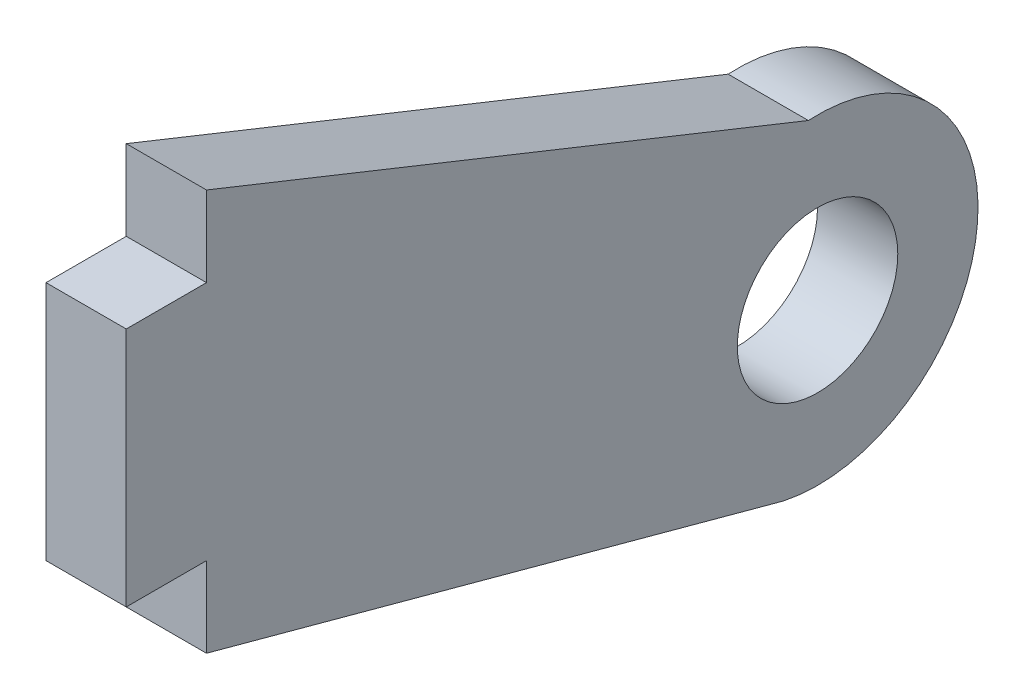
ISO-10303-21;
HEADER;
FILE_DESCRIPTION(('STEP AP214'),'2;1');
FILE_NAME('part.step','',(''),(''),'','','');
FILE_SCHEMA(('AUTOMOTIVE_DESIGN { 1 0 10303 214 1 1 1 1 }'));
ENDSEC;
DATA;
#1=APPLICATION_CONTEXT('core data for automotive mechanical design processes');
#2=APPLICATION_PROTOCOL_DEFINITION('international standard','automotive_design',2000,#1);
#3=PRODUCT_CONTEXT('',#1,'mechanical');
#4=PRODUCT('Part','Part','',(#3));
#5=PRODUCT_RELATED_PRODUCT_CATEGORY('part','',(#4));
#6=PRODUCT_DEFINITION_FORMATION('','',#4);
#7=PRODUCT_DEFINITION_CONTEXT('part definition',#1,'design');
#8=PRODUCT_DEFINITION('design','',#6,#7);
#9=PRODUCT_DEFINITION_SHAPE('','',#8);
#10=(LENGTH_UNIT() NAMED_UNIT(*) SI_UNIT(.MILLI.,.METRE.));
#11=(NAMED_UNIT(*) PLANE_ANGLE_UNIT() SI_UNIT($,.RADIAN.));
#12=(NAMED_UNIT(*) SI_UNIT($,.STERADIAN.) SOLID_ANGLE_UNIT());
#13=UNCERTAINTY_MEASURE_WITH_UNIT(LENGTH_MEASURE(1.E-05),#10,'distance_accuracy_value','');
#14=(GEOMETRIC_REPRESENTATION_CONTEXT(3) GLOBAL_UNCERTAINTY_ASSIGNED_CONTEXT((#13)) GLOBAL_UNIT_ASSIGNED_CONTEXT((#10,
#11,#12)) REPRESENTATION_CONTEXT('',''));
#15=CARTESIAN_POINT('',(0.,0.,0.));
#16=DIRECTION('',(0.,0.,1.));
#17=DIRECTION('',(1.,0.,0.));
#18=AXIS2_PLACEMENT_3D('',#15,#16,#17);
#19=CARTESIAN_POINT('',(2.,-4.99344630629626,-16.2288811891108));
#20=DIRECTION('',(1.,0.,0.));
#21=DIRECTION('',(0.,0.,-1.));
#22=AXIS2_PLACEMENT_3D('',#19,#20,#21);
#23=PLANE('',#22);
#24=DIRECTION('',(0.,0.,-1.));
#25=VECTOR('',#24,1.);
#26=CARTESIAN_POINT('',(2.,-3.,1.));
#27=LINE('',#26,#25);
#28=CARTESIAN_POINT('',(2.,-3.,1.));
#29=VERTEX_POINT('',#28);
#30=CARTESIAN_POINT('',(2.,-3.,-1.));
#31=VERTEX_POINT('',#30);
#32=EDGE_CURVE('E145',#29,#31,#27,.T.);
#33=ORIENTED_EDGE('',*,*,#32,.T.);
#34=DIRECTION('',(0.,-1.,0.));
#35=VECTOR('',#34,1.);
#36=CARTESIAN_POINT('',(2.,-5.,-1.));
#37=LINE('',#36,#35);
#38=CARTESIAN_POINT('',(2.,-5.,-1.));
#39=VERTEX_POINT('',#38);
#40=EDGE_CURVE('E93',#31,#39,#37,.T.);
#41=ORIENTED_EDGE('',*,*,#40,.T.);
#42=DIRECTION('',(0.,-0.261950631674574,-0.965081274590535));
#43=VECTOR('',#42,1.);
#44=CARTESIAN_POINT('',(2.,-5.,-1.));
#45=LINE('',#44,#43);
#46=CARTESIAN_POINT('',(2.,-8.8,-15.));
#47=VERTEX_POINT('',#46);
#48=EDGE_CURVE('E160',#39,#47,#45,.T.);
#49=ORIENTED_EDGE('',*,*,#48,.T.);
#50=CARTESIAN_POINT('',(2.,-4.99344630629626,-16.2288811891108));
#51=DIRECTION('',(1.,0.,0.));
#52=DIRECTION('',(0.,0.,-1.));
#53=AXIS2_PLACEMENT_3D('',#50,#51,#52);
#54=CIRCLE('',#53,4.);
#55=CARTESIAN_POINT('',(2.,-1.,-16.));
#56=VERTEX_POINT('',#55);
#57=EDGE_CURVE('E173',#47,#56,#54,.T.);
#58=ORIENTED_EDGE('',*,*,#57,.T.);
#59=DIRECTION('',(0.,0.371390676354104,0.928476690885259));
#60=VECTOR('',#59,1.);
#61=CARTESIAN_POINT('',(2.,5.,-1.));
#62=LINE('',#61,#60);
#63=CARTESIAN_POINT('',(2.,5.,-1.));
#64=VERTEX_POINT('',#63);
#65=EDGE_CURVE('E112',#56,#64,#62,.T.);
#66=ORIENTED_EDGE('',*,*,#65,.T.);
#67=DIRECTION('',(0.,-1.,0.));
#68=VECTOR('',#67,1.);
#69=CARTESIAN_POINT('',(2.,3.,-1.));
#70=LINE('',#69,#68);
#71=CARTESIAN_POINT('',(2.,3.,-1.));
#72=VERTEX_POINT('',#71);
#73=EDGE_CURVE('E106',#64,#72,#70,.T.);
#74=ORIENTED_EDGE('',*,*,#73,.T.);
#75=DIRECTION('',(0.,0.,1.));
#76=VECTOR('',#75,1.);
#77=CARTESIAN_POINT('',(2.,3.,1.));
#78=LINE('',#77,#76);
#79=CARTESIAN_POINT('',(2.,3.,1.));
#80=VERTEX_POINT('',#79);
#81=EDGE_CURVE('E110',#72,#80,#78,.T.);
#82=ORIENTED_EDGE('',*,*,#81,.T.);
#83=DIRECTION('',(0.,-1.,0.));
#84=VECTOR('',#83,1.);
#85=CARTESIAN_POINT('',(2.,3.,1.));
#86=LINE('',#85,#84);
#87=EDGE_CURVE('E50',#80,#29,#86,.T.);
#88=ORIENTED_EDGE('',*,*,#87,.T.);
#89=EDGE_LOOP('',(#33,#41,#49,#58,#66,#74,#82,#88));
#90=FACE_BOUND('',#89,.T.);
#91=CARTESIAN_POINT('',(2.,-4.99344630629626,-16.2288811891108));
#92=DIRECTION('',(1.,0.,0.));
#93=DIRECTION('',(0.,0.,-1.));
#94=AXIS2_PLACEMENT_3D('',#91,#92,#93);
#95=CIRCLE('',#94,2.00000000000001);
#96=CARTESIAN_POINT('',(2.,-4.99344630629626,-18.2288811891108));
#97=VERTEX_POINT('',#96);
#98=EDGE_CURVE('E134',#97,#97,#95,.T.);
#99=ORIENTED_EDGE('',*,*,#98,.F.);
#100=EDGE_LOOP('',(#99));
#101=FACE_BOUND('',#100,.T.);
#102=ADVANCED_FACE('F33',(#90,#101),#23,.T.);
#103=CARTESIAN_POINT('',(0.,-4.99344630629626,-16.2288811891108));
#104=DIRECTION('',(1.,0.,0.));
#105=DIRECTION('',(0.,0.,-1.));
#106=AXIS2_PLACEMENT_3D('',#103,#104,#105);
#107=PLANE('',#106);
#108=DIRECTION('',(0.,0.,-1.));
#109=VECTOR('',#108,1.);
#110=CARTESIAN_POINT('',(0.,-3.,1.));
#111=LINE('',#110,#109);
#112=CARTESIAN_POINT('',(0.,-3.,1.));
#113=VERTEX_POINT('',#112);
#114=CARTESIAN_POINT('',(0.,-3.,-1.));
#115=VERTEX_POINT('',#114);
#116=EDGE_CURVE('E130',#113,#115,#111,.T.);
#117=ORIENTED_EDGE('',*,*,#116,.F.);
#118=DIRECTION('',(0.,-1.,0.));
#119=VECTOR('',#118,1.);
#120=CARTESIAN_POINT('',(0.,3.,1.));
#121=LINE('',#120,#119);
#122=CARTESIAN_POINT('',(0.,3.,1.));
#123=VERTEX_POINT('',#122);
#124=EDGE_CURVE('E85',#123,#113,#121,.T.);
#125=ORIENTED_EDGE('',*,*,#124,.F.);
#126=DIRECTION('',(0.,0.,1.));
#127=VECTOR('',#126,1.);
#128=CARTESIAN_POINT('',(0.,3.,1.));
#129=LINE('',#128,#127);
#130=CARTESIAN_POINT('',(0.,3.,-1.));
#131=VERTEX_POINT('',#130);
#132=EDGE_CURVE('E79',#131,#123,#129,.T.);
#133=ORIENTED_EDGE('',*,*,#132,.F.);
#134=DIRECTION('',(0.,-1.,0.));
#135=VECTOR('',#134,1.);
#136=CARTESIAN_POINT('',(0.,3.,-1.));
#137=LINE('',#136,#135);
#138=CARTESIAN_POINT('',(0.,5.,-1.));
#139=VERTEX_POINT('',#138);
#140=EDGE_CURVE('E120',#139,#131,#137,.T.);
#141=ORIENTED_EDGE('',*,*,#140,.F.);
#142=DIRECTION('',(0.,0.371390676354104,0.928476690885259));
#143=VECTOR('',#142,1.);
#144=CARTESIAN_POINT('',(0.,5.,-1.));
#145=LINE('',#144,#143);
#146=CARTESIAN_POINT('',(0.,-1.,-16.));
#147=VERTEX_POINT('',#146);
#148=EDGE_CURVE('E140',#147,#139,#145,.T.);
#149=ORIENTED_EDGE('',*,*,#148,.F.);
#150=CARTESIAN_POINT('',(0.,-4.99344630629626,-16.2288811891108));
#151=DIRECTION('',(1.,0.,0.));
#152=DIRECTION('',(0.,0.,-1.));
#153=AXIS2_PLACEMENT_3D('',#150,#151,#152);
#154=CIRCLE('',#153,4.);
#155=CARTESIAN_POINT('',(0.,-8.8,-15.));
#156=VERTEX_POINT('',#155);
#157=EDGE_CURVE('E138',#156,#147,#154,.T.);
#158=ORIENTED_EDGE('',*,*,#157,.F.);
#159=DIRECTION('',(0.,-0.261950631674574,-0.965081274590535));
#160=VECTOR('',#159,1.);
#161=CARTESIAN_POINT('',(0.,-5.,-1.));
#162=LINE('',#161,#160);
#163=CARTESIAN_POINT('',(0.,-5.,-1.));
#164=VERTEX_POINT('',#163);
#165=EDGE_CURVE('E136',#164,#156,#162,.T.);
#166=ORIENTED_EDGE('',*,*,#165,.F.);
#167=DIRECTION('',(0.,-1.,0.));
#168=VECTOR('',#167,1.);
#169=CARTESIAN_POINT('',(0.,-5.,-1.));
#170=LINE('',#169,#168);
#171=EDGE_CURVE('E133',#115,#164,#170,.T.);
#172=ORIENTED_EDGE('',*,*,#171,.F.);
#173=EDGE_LOOP('',(#117,#125,#133,#141,#149,#158,#166,#172));
#174=FACE_BOUND('',#173,.T.);
#175=CARTESIAN_POINT('',(0.,-4.99344630629626,-16.2288811891108));
#176=DIRECTION('',(1.,0.,0.));
#177=DIRECTION('',(0.,0.,-1.));
#178=AXIS2_PLACEMENT_3D('',#175,#176,#177);
#179=CIRCLE('',#178,2.00000000000001);
#180=CARTESIAN_POINT('',(0.,-4.99344630629626,-18.2288811891108));
#181=VERTEX_POINT('',#180);
#182=EDGE_CURVE('E179',#181,#181,#179,.T.);
#183=ORIENTED_EDGE('',*,*,#182,.T.);
#184=EDGE_LOOP('',(#183));
#185=FACE_BOUND('',#184,.T.);
#186=ADVANCED_FACE('F164',(#174,#185),#107,.F.);
#187=CARTESIAN_POINT('',(2.,-3.,1.));
#188=DIRECTION('',(0.,1.,0.));
#189=DIRECTION('',(0.,0.,1.));
#190=AXIS2_PLACEMENT_3D('',#187,#188,#189);
#191=PLANE('',#190);
#192=ORIENTED_EDGE('',*,*,#116,.T.);
#193=DIRECTION('',(-1.,0.,0.));
#194=VECTOR('',#193,1.);
#195=CARTESIAN_POINT('',(2.,-3.,-1.));
#196=LINE('',#195,#194);
#197=EDGE_CURVE('E11',#31,#115,#196,.T.);
#198=ORIENTED_EDGE('',*,*,#197,.F.);
#199=ORIENTED_EDGE('',*,*,#32,.F.);
#200=DIRECTION('',(-1.,0.,0.));
#201=VECTOR('',#200,1.);
#202=CARTESIAN_POINT('',(2.,-3.,1.));
#203=LINE('',#202,#201);
#204=EDGE_CURVE('E126',#29,#113,#203,.T.);
#205=ORIENTED_EDGE('',*,*,#204,.T.);
#206=EDGE_LOOP('',(#192,#198,#199,#205));
#207=FACE_BOUND('',#206,.T.);
#208=ADVANCED_FACE('F35',(#207),#191,.F.);
#209=CARTESIAN_POINT('',(2.,-5.,-1.));
#210=DIRECTION('',(0.,0.,-1.));
#211=DIRECTION('',(0.,1.,0.));
#212=AXIS2_PLACEMENT_3D('',#209,#210,#211);
#213=PLANE('',#212);
#214=ORIENTED_EDGE('',*,*,#171,.T.);
#215=DIRECTION('',(-1.,0.,0.));
#216=VECTOR('',#215,1.);
#217=CARTESIAN_POINT('',(2.,-5.,-1.));
#218=LINE('',#217,#216);
#219=EDGE_CURVE('E42',#39,#164,#218,.T.);
#220=ORIENTED_EDGE('',*,*,#219,.F.);
#221=ORIENTED_EDGE('',*,*,#40,.F.);
#222=ORIENTED_EDGE('',*,*,#197,.T.);
#223=EDGE_LOOP('',(#214,#220,#221,#222));
#224=FACE_BOUND('',#223,.T.);
#225=ADVANCED_FACE('F207',(#224),#213,.F.);
#226=CARTESIAN_POINT('',(2.,-5.,-1.));
#227=DIRECTION('',(0.,0.965081274590535,-0.261950631674574));
#228=DIRECTION('',(0.,0.261950631674574,0.965081274590535));
#229=AXIS2_PLACEMENT_3D('',#226,#227,#228);
#230=PLANE('',#229);
#231=ORIENTED_EDGE('',*,*,#165,.T.);
#232=DIRECTION('',(-1.,0.,0.));
#233=VECTOR('',#232,1.);
#234=CARTESIAN_POINT('',(2.,-8.8,-15.));
#235=LINE('',#234,#233);
#236=EDGE_CURVE('E152',#47,#156,#235,.T.);
#237=ORIENTED_EDGE('',*,*,#236,.F.);
#238=ORIENTED_EDGE('',*,*,#48,.F.);
#239=ORIENTED_EDGE('',*,*,#219,.T.);
#240=EDGE_LOOP('',(#231,#237,#238,#239));
#241=FACE_BOUND('',#240,.T.);
#242=ADVANCED_FACE('F158',(#241),#230,.F.);
#243=CARTESIAN_POINT('',(2.,-4.99344630629626,-16.2288811891108));
#244=DIRECTION('',(-1.,0.,0.));
#245=DIRECTION('',(0.,0.,1.));
#246=AXIS2_PLACEMENT_3D('',#243,#244,#245);
#247=CYLINDRICAL_SURFACE('',#246,4.);
#248=ORIENTED_EDGE('',*,*,#157,.T.);
#249=DIRECTION('',(-1.,0.,0.));
#250=VECTOR('',#249,1.);
#251=CARTESIAN_POINT('',(2.,-1.,-16.));
#252=LINE('',#251,#250);
#253=EDGE_CURVE('E149',#56,#147,#252,.T.);
#254=ORIENTED_EDGE('',*,*,#253,.F.);
#255=ORIENTED_EDGE('',*,*,#57,.F.);
#256=ORIENTED_EDGE('',*,*,#236,.T.);
#257=EDGE_LOOP('',(#248,#254,#255,#256));
#258=FACE_BOUND('',#257,.T.);
#259=ADVANCED_FACE('F169',(#258),#247,.T.);
#260=CARTESIAN_POINT('',(2.,5.,-1.));
#261=DIRECTION('',(0.,-0.928476690885259,0.371390676354104));
#262=DIRECTION('',(0.,-0.371390676354104,-0.928476690885259));
#263=AXIS2_PLACEMENT_3D('',#260,#261,#262);
#264=PLANE('',#263);
#265=ORIENTED_EDGE('',*,*,#148,.T.);
#266=DIRECTION('',(-1.,0.,0.));
#267=VECTOR('',#266,1.);
#268=CARTESIAN_POINT('',(2.,5.,-1.));
#269=LINE('',#268,#267);
#270=EDGE_CURVE('E121',#64,#139,#269,.T.);
#271=ORIENTED_EDGE('',*,*,#270,.F.);
#272=ORIENTED_EDGE('',*,*,#65,.F.);
#273=ORIENTED_EDGE('',*,*,#253,.T.);
#274=EDGE_LOOP('',(#265,#271,#272,#273));
#275=FACE_BOUND('',#274,.T.);
#276=ADVANCED_FACE('F172',(#275),#264,.F.);
#277=CARTESIAN_POINT('',(2.,3.,-1.));
#278=DIRECTION('',(0.,0.,-1.));
#279=DIRECTION('',(-1.,0.,0.));
#280=AXIS2_PLACEMENT_3D('',#277,#278,#279);
#281=PLANE('',#280);
#282=ORIENTED_EDGE('',*,*,#140,.T.);
#283=DIRECTION('',(-1.,0.,0.));
#284=VECTOR('',#283,1.);
#285=CARTESIAN_POINT('',(2.,3.,-1.));
#286=LINE('',#285,#284);
#287=EDGE_CURVE('E117',#72,#131,#286,.T.);
#288=ORIENTED_EDGE('',*,*,#287,.F.);
#289=ORIENTED_EDGE('',*,*,#73,.F.);
#290=ORIENTED_EDGE('',*,*,#270,.T.);
#291=EDGE_LOOP('',(#282,#288,#289,#290));
#292=FACE_BOUND('',#291,.T.);
#293=ADVANCED_FACE('F118',(#292),#281,.F.);
#294=CARTESIAN_POINT('',(2.,3.,1.));
#295=DIRECTION('',(0.,-1.,0.));
#296=DIRECTION('',(0.,0.,-1.));
#297=AXIS2_PLACEMENT_3D('',#294,#295,#296);
#298=PLANE('',#297);
#299=ORIENTED_EDGE('',*,*,#132,.T.);
#300=DIRECTION('',(-1.,0.,0.));
#301=VECTOR('',#300,1.);
#302=CARTESIAN_POINT('',(2.,3.,1.));
#303=LINE('',#302,#301);
#304=EDGE_CURVE('E122',#80,#123,#303,.T.);
#305=ORIENTED_EDGE('',*,*,#304,.F.);
#306=ORIENTED_EDGE('',*,*,#81,.F.);
#307=ORIENTED_EDGE('',*,*,#287,.T.);
#308=EDGE_LOOP('',(#299,#305,#306,#307));
#309=FACE_BOUND('',#308,.T.);
#310=ADVANCED_FACE('F124',(#309),#298,.F.);
#311=CARTESIAN_POINT('',(2.,3.,1.));
#312=DIRECTION('',(0.,0.,-1.));
#313=DIRECTION('',(0.,1.,0.));
#314=AXIS2_PLACEMENT_3D('',#311,#312,#313);
#315=PLANE('',#314);
#316=ORIENTED_EDGE('',*,*,#124,.T.);
#317=ORIENTED_EDGE('',*,*,#204,.F.);
#318=ORIENTED_EDGE('',*,*,#87,.F.);
#319=ORIENTED_EDGE('',*,*,#304,.T.);
#320=EDGE_LOOP('',(#316,#317,#318,#319));
#321=FACE_BOUND('',#320,.T.);
#322=ADVANCED_FACE('F195',(#321),#315,.F.);
#323=CARTESIAN_POINT('',(2.,-4.99344630629626,-16.2288811891108));
#324=DIRECTION('',(-1.,0.,0.));
#325=DIRECTION('',(0.,0.,1.));
#326=AXIS2_PLACEMENT_3D('',#323,#324,#325);
#327=CYLINDRICAL_SURFACE('',#326,2.00000000000001);
#328=ORIENTED_EDGE('',*,*,#98,.T.);
#329=EDGE_LOOP('',(#328));
#330=FACE_BOUND('',#329,.T.);
#331=ORIENTED_EDGE('',*,*,#182,.F.);
#332=EDGE_LOOP('',(#331));
#333=FACE_BOUND('',#332,.T.);
#334=ADVANCED_FACE('F185',(#330,#333),#327,.F.);
#335=CLOSED_SHELL('',(#102,#186,#208,#225,#242,#259,#276,#293,#310,#322,#334));
#336=MANIFOLD_SOLID_BREP('B2',#335);
#337=ADVANCED_BREP_SHAPE_REPRESENTATION('',(#18,#336),#14);
#338=SHAPE_DEFINITION_REPRESENTATION(#9,#337);
ENDSEC;
END-ISO-10303-21;
